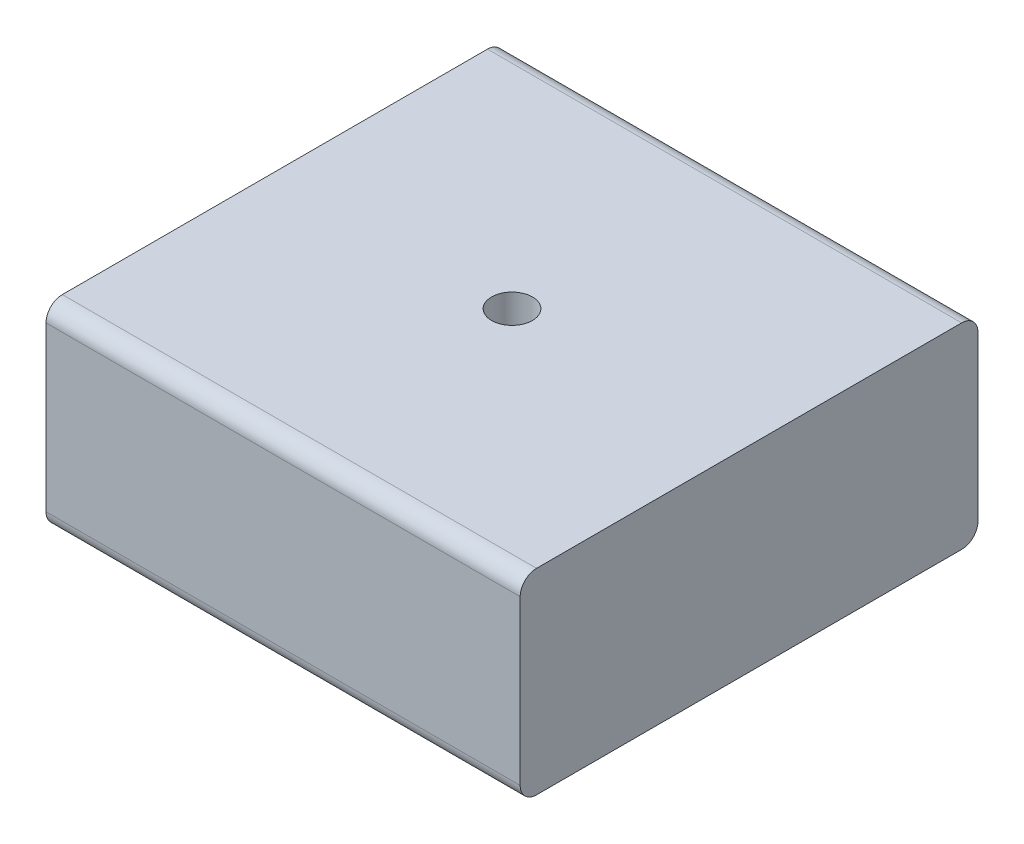
ISO-10303-21;
HEADER;
FILE_DESCRIPTION(('STEP AP214'),'2;1');
FILE_NAME('part.step','',(''),(''),'','','');
FILE_SCHEMA(('AUTOMOTIVE_DESIGN { 1 0 10303 214 1 1 1 1 }'));
ENDSEC;
DATA;
#1=APPLICATION_CONTEXT('core data for automotive mechanical design processes');
#2=APPLICATION_PROTOCOL_DEFINITION('international standard','automotive_design',2000,#1);
#3=PRODUCT_CONTEXT('',#1,'mechanical');
#4=PRODUCT('Part','Part','',(#3));
#5=PRODUCT_RELATED_PRODUCT_CATEGORY('part','',(#4));
#6=PRODUCT_DEFINITION_FORMATION('','',#4);
#7=PRODUCT_DEFINITION_CONTEXT('part definition',#1,'design');
#8=PRODUCT_DEFINITION('design','',#6,#7);
#9=PRODUCT_DEFINITION_SHAPE('','',#8);
#10=(LENGTH_UNIT() NAMED_UNIT(*) SI_UNIT(.MILLI.,.METRE.));
#11=(NAMED_UNIT(*) PLANE_ANGLE_UNIT() SI_UNIT($,.RADIAN.));
#12=(NAMED_UNIT(*) SI_UNIT($,.STERADIAN.) SOLID_ANGLE_UNIT());
#13=UNCERTAINTY_MEASURE_WITH_UNIT(LENGTH_MEASURE(1.E-05),#10,'distance_accuracy_value','');
#14=(GEOMETRIC_REPRESENTATION_CONTEXT(3) GLOBAL_UNCERTAINTY_ASSIGNED_CONTEXT((#13)) GLOBAL_UNIT_ASSIGNED_CONTEXT((#10,
#11,#12)) REPRESENTATION_CONTEXT('',''));
#15=CARTESIAN_POINT('',(0.,0.,0.));
#16=DIRECTION('',(0.,0.,1.));
#17=DIRECTION('',(1.,0.,0.));
#18=AXIS2_PLACEMENT_3D('',#15,#16,#17);
#19=CARTESIAN_POINT('',(-46.0375,38.1,88.9));
#20=DIRECTION('',(0.,-1.,0.));
#21=DIRECTION('',(1.,0.,0.));
#22=AXIS2_PLACEMENT_3D('',#19,#20,#21);
#23=PLANE('',#22);
#24=DIRECTION('',(0.,0.,-1.));
#25=VECTOR('',#24,1.);
#26=CARTESIAN_POINT('',(46.0375,38.1,88.9));
#27=LINE('',#26,#25);
#28=CARTESIAN_POINT('',(46.0375,38.1,85.725));
#29=VERTEX_POINT('',#28);
#30=CARTESIAN_POINT('',(46.0375,38.1,3.175));
#31=VERTEX_POINT('',#30);
#32=EDGE_CURVE('E121',#29,#31,#27,.T.);
#33=ORIENTED_EDGE('',*,*,#32,.T.);
#34=DIRECTION('',(-1.,0.,0.));
#35=VECTOR('',#34,1.);
#36=CARTESIAN_POINT('',(-46.0375,38.1,3.175));
#37=LINE('',#36,#35);
#38=CARTESIAN_POINT('',(-46.0375,38.1,3.175));
#39=VERTEX_POINT('',#38);
#40=EDGE_CURVE('E11',#31,#39,#37,.T.);
#41=ORIENTED_EDGE('',*,*,#40,.T.);
#42=DIRECTION('',(0.,0.,-1.));
#43=VECTOR('',#42,1.);
#44=CARTESIAN_POINT('',(-46.0375,38.1,88.9));
#45=LINE('',#44,#43);
#46=CARTESIAN_POINT('',(-46.0375,38.1,85.725));
#47=VERTEX_POINT('',#46);
#48=EDGE_CURVE('E152',#47,#39,#45,.T.);
#49=ORIENTED_EDGE('',*,*,#48,.F.);
#50=DIRECTION('',(-1.,0.,0.));
#51=VECTOR('',#50,1.);
#52=CARTESIAN_POINT('',(46.0375,38.1,85.725));
#53=LINE('',#52,#51);
#54=EDGE_CURVE('E41',#47,#29,#53,.F.);
#55=ORIENTED_EDGE('',*,*,#54,.T.);
#56=EDGE_LOOP('',(#33,#41,#49,#55));
#57=FACE_BOUND('',#56,.T.);
#58=CARTESIAN_POINT('',(0.,38.1,44.45));
#59=DIRECTION('',(0.,1.,0.));
#60=DIRECTION('',(0.,0.,1.));
#61=AXIS2_PLACEMENT_3D('',#58,#59,#60);
#62=CIRCLE('',#61,3.96874999999999);
#63=CARTESIAN_POINT('',(0.,38.1,48.41875));
#64=VERTEX_POINT('',#63);
#65=EDGE_CURVE('E224',#64,#64,#62,.T.);
#66=ORIENTED_EDGE('',*,*,#65,.F.);
#67=EDGE_LOOP('',(#66));
#68=FACE_BOUND('',#67,.T.);
#69=ADVANCED_FACE('F33',(#57,#68),#23,.F.);
#70=CARTESIAN_POINT('',(-46.0375,38.1,88.9));
#71=DIRECTION('',(1.,0.,0.));
#72=DIRECTION('',(0.,1.,0.));
#73=AXIS2_PLACEMENT_3D('',#70,#71,#72);
#74=PLANE('',#73);
#75=DIRECTION('',(0.,-1.,0.));
#76=VECTOR('',#75,1.);
#77=CARTESIAN_POINT('',(-46.0375,38.1,0.));
#78=LINE('',#77,#76);
#79=CARTESIAN_POINT('',(-46.0375,34.925,0.));
#80=VERTEX_POINT('',#79);
#81=CARTESIAN_POINT('',(-46.0375,3.17500000000001,0.));
#82=VERTEX_POINT('',#81);
#83=EDGE_CURVE('E168',#80,#82,#78,.T.);
#84=ORIENTED_EDGE('',*,*,#83,.T.);
#85=CARTESIAN_POINT('',(-46.0375,3.175,3.175));
#86=DIRECTION('',(1.,0.,0.));
#87=DIRECTION('',(0.,1.,0.));
#88=AXIS2_PLACEMENT_3D('',#85,#86,#87);
#89=CIRCLE('',#88,3.175);
#90=CARTESIAN_POINT('',(-46.0375,0.,3.175));
#91=VERTEX_POINT('',#90);
#92=EDGE_CURVE('E141',#82,#91,#89,.F.);
#93=ORIENTED_EDGE('',*,*,#92,.T.);
#94=DIRECTION('',(0.,0.,-1.));
#95=VECTOR('',#94,1.);
#96=CARTESIAN_POINT('',(-46.0375,0.,88.9));
#97=LINE('',#96,#95);
#98=CARTESIAN_POINT('',(-46.0375,0.,85.725));
#99=VERTEX_POINT('',#98);
#100=EDGE_CURVE('E120',#99,#91,#97,.T.);
#101=ORIENTED_EDGE('',*,*,#100,.F.);
#102=CARTESIAN_POINT('',(-46.0375,3.175,85.725));
#103=DIRECTION('',(1.,0.,0.));
#104=DIRECTION('',(0.,1.,0.));
#105=AXIS2_PLACEMENT_3D('',#102,#103,#104);
#106=CIRCLE('',#105,3.175);
#107=CARTESIAN_POINT('',(-46.0375,3.17500000000001,88.9));
#108=VERTEX_POINT('',#107);
#109=EDGE_CURVE('E125',#99,#108,#106,.F.);
#110=ORIENTED_EDGE('',*,*,#109,.T.);
#111=DIRECTION('',(0.,-1.,0.));
#112=VECTOR('',#111,1.);
#113=CARTESIAN_POINT('',(-46.0375,38.1,88.9));
#114=LINE('',#113,#112);
#115=CARTESIAN_POINT('',(-46.0375,34.925,88.9));
#116=VERTEX_POINT('',#115);
#117=EDGE_CURVE('E162',#116,#108,#114,.T.);
#118=ORIENTED_EDGE('',*,*,#117,.F.);
#119=CARTESIAN_POINT('',(-46.0375,34.925,85.725));
#120=DIRECTION('',(1.,0.,0.));
#121=DIRECTION('',(0.,1.,0.));
#122=AXIS2_PLACEMENT_3D('',#119,#120,#121);
#123=CIRCLE('',#122,3.175);
#124=EDGE_CURVE('E55',#116,#47,#123,.F.);
#125=ORIENTED_EDGE('',*,*,#124,.T.);
#126=ORIENTED_EDGE('',*,*,#48,.T.);
#127=CARTESIAN_POINT('',(-46.0375,34.925,3.175));
#128=DIRECTION('',(1.,0.,0.));
#129=DIRECTION('',(0.,1.,0.));
#130=AXIS2_PLACEMENT_3D('',#127,#128,#129);
#131=CIRCLE('',#130,3.175);
#132=EDGE_CURVE('E48',#39,#80,#131,.F.);
#133=ORIENTED_EDGE('',*,*,#132,.T.);
#134=EDGE_LOOP('',(#84,#93,#101,#110,#118,#125,#126,#133));
#135=FACE_BOUND('',#134,.T.);
#136=ADVANCED_FACE('F164',(#135),#74,.F.);
#137=CARTESIAN_POINT('',(-46.0375,0.,88.9));
#138=DIRECTION('',(0.,1.,0.));
#139=DIRECTION('',(-1.,0.,0.));
#140=AXIS2_PLACEMENT_3D('',#137,#138,#139);
#141=PLANE('',#140);
#142=CARTESIAN_POINT('',(0.,0.,44.45));
#143=DIRECTION('',(0.,1.,0.));
#144=DIRECTION('',(-1.,0.,0.));
#145=AXIS2_PLACEMENT_3D('',#142,#143,#144);
#146=CIRCLE('',#145,3.96874999999999);
#147=CARTESIAN_POINT('',(-3.96875,0.,44.45));
#148=VERTEX_POINT('',#147);
#149=EDGE_CURVE('E171',#148,#148,#146,.T.);
#150=ORIENTED_EDGE('',*,*,#149,.T.);
#151=EDGE_LOOP('',(#150));
#152=FACE_BOUND('',#151,.T.);
#153=ORIENTED_EDGE('',*,*,#100,.T.);
#154=DIRECTION('',(1.,0.,0.));
#155=VECTOR('',#154,1.);
#156=CARTESIAN_POINT('',(-46.0375,0.,3.175));
#157=LINE('',#156,#155);
#158=CARTESIAN_POINT('',(46.0375,0.,3.175));
#159=VERTEX_POINT('',#158);
#160=EDGE_CURVE('E119',#91,#159,#157,.T.);
#161=ORIENTED_EDGE('',*,*,#160,.T.);
#162=DIRECTION('',(0.,0.,-1.));
#163=VECTOR('',#162,1.);
#164=CARTESIAN_POINT('',(46.0375,0.,88.9));
#165=LINE('',#164,#163);
#166=CARTESIAN_POINT('',(46.0375,0.,85.725));
#167=VERTEX_POINT('',#166);
#168=EDGE_CURVE('E102',#167,#159,#165,.T.);
#169=ORIENTED_EDGE('',*,*,#168,.F.);
#170=DIRECTION('',(1.,0.,0.));
#171=VECTOR('',#170,1.);
#172=CARTESIAN_POINT('',(-46.0375,0.,85.725));
#173=LINE('',#172,#171);
#174=EDGE_CURVE('E116',#167,#99,#173,.F.);
#175=ORIENTED_EDGE('',*,*,#174,.T.);
#176=EDGE_LOOP('',(#153,#161,#169,#175));
#177=FACE_BOUND('',#176,.T.);
#178=ADVANCED_FACE('F115',(#152,#177),#141,.F.);
#179=CARTESIAN_POINT('',(46.0375,38.1,88.9));
#180=DIRECTION('',(-1.,0.,0.));
#181=DIRECTION('',(0.,-1.,0.));
#182=AXIS2_PLACEMENT_3D('',#179,#180,#181);
#183=PLANE('',#182);
#184=ORIENTED_EDGE('',*,*,#168,.T.);
#185=CARTESIAN_POINT('',(46.0375,3.17500000000002,3.175));
#186=DIRECTION('',(-1.,0.,0.));
#187=DIRECTION('',(0.,-1.,0.));
#188=AXIS2_PLACEMENT_3D('',#185,#186,#187);
#189=CIRCLE('',#188,3.175);
#190=CARTESIAN_POINT('',(46.0375,3.17500000000003,0.));
#191=VERTEX_POINT('',#190);
#192=EDGE_CURVE('E109',#159,#191,#189,.F.);
#193=ORIENTED_EDGE('',*,*,#192,.T.);
#194=DIRECTION('',(0.,1.,0.));
#195=VECTOR('',#194,1.);
#196=CARTESIAN_POINT('',(46.0375,38.1,0.));
#197=LINE('',#196,#195);
#198=CARTESIAN_POINT('',(46.0375,34.925,0.));
#199=VERTEX_POINT('',#198);
#200=EDGE_CURVE('E165',#191,#199,#197,.T.);
#201=ORIENTED_EDGE('',*,*,#200,.T.);
#202=CARTESIAN_POINT('',(46.0375,34.925,3.175));
#203=DIRECTION('',(-1.,0.,0.));
#204=DIRECTION('',(0.,-1.,0.));
#205=AXIS2_PLACEMENT_3D('',#202,#203,#204);
#206=CIRCLE('',#205,3.175);
#207=EDGE_CURVE('E110',#199,#31,#206,.F.);
#208=ORIENTED_EDGE('',*,*,#207,.T.);
#209=ORIENTED_EDGE('',*,*,#32,.F.);
#210=CARTESIAN_POINT('',(46.0375,34.925,85.725));
#211=DIRECTION('',(-1.,0.,0.));
#212=DIRECTION('',(0.,-1.,0.));
#213=AXIS2_PLACEMENT_3D('',#210,#211,#212);
#214=CIRCLE('',#213,3.175);
#215=CARTESIAN_POINT('',(46.0375,34.925,88.9));
#216=VERTEX_POINT('',#215);
#217=EDGE_CURVE('E127',#29,#216,#214,.F.);
#218=ORIENTED_EDGE('',*,*,#217,.T.);
#219=DIRECTION('',(0.,1.,0.));
#220=VECTOR('',#219,1.);
#221=CARTESIAN_POINT('',(46.0375,38.1,88.9));
#222=LINE('',#221,#220);
#223=CARTESIAN_POINT('',(46.0375,3.17500000000003,88.9));
#224=VERTEX_POINT('',#223);
#225=EDGE_CURVE('E104',#224,#216,#222,.T.);
#226=ORIENTED_EDGE('',*,*,#225,.F.);
#227=CARTESIAN_POINT('',(46.0375,3.17500000000002,85.725));
#228=DIRECTION('',(-1.,0.,0.));
#229=DIRECTION('',(0.,-1.,0.));
#230=AXIS2_PLACEMENT_3D('',#227,#228,#229);
#231=CIRCLE('',#230,3.175);
#232=EDGE_CURVE('E99',#224,#167,#231,.F.);
#233=ORIENTED_EDGE('',*,*,#232,.T.);
#234=EDGE_LOOP('',(#184,#193,#201,#208,#209,#218,#226,#233));
#235=FACE_BOUND('',#234,.T.);
#236=ADVANCED_FACE('F101',(#235),#183,.F.);
#237=CARTESIAN_POINT('',(0.,0.,88.9));
#238=DIRECTION('',(0.,0.,1.));
#239=DIRECTION('',(1.,0.,0.));
#240=AXIS2_PLACEMENT_3D('',#237,#238,#239);
#241=PLANE('',#240);
#242=ORIENTED_EDGE('',*,*,#117,.T.);
#243=DIRECTION('',(1.,0.,0.));
#244=VECTOR('',#243,1.);
#245=CARTESIAN_POINT('',(46.0375,3.17500000000002,88.9));
#246=LINE('',#245,#244);
#247=EDGE_CURVE('E146',#108,#224,#246,.T.);
#248=ORIENTED_EDGE('',*,*,#247,.T.);
#249=ORIENTED_EDGE('',*,*,#225,.T.);
#250=DIRECTION('',(-1.,0.,0.));
#251=VECTOR('',#250,1.);
#252=CARTESIAN_POINT('',(-46.0375,34.925,88.9));
#253=LINE('',#252,#251);
#254=EDGE_CURVE('E143',#216,#116,#253,.T.);
#255=ORIENTED_EDGE('',*,*,#254,.T.);
#256=EDGE_LOOP('',(#242,#248,#249,#255));
#257=FACE_BOUND('',#256,.T.);
#258=ADVANCED_FACE('F161',(#257),#241,.T.);
#259=CARTESIAN_POINT('',(0.,0.,0.));
#260=DIRECTION('',(0.,0.,1.));
#261=DIRECTION('',(1.,0.,0.));
#262=AXIS2_PLACEMENT_3D('',#259,#260,#261);
#263=PLANE('',#262);
#264=ORIENTED_EDGE('',*,*,#200,.F.);
#265=DIRECTION('',(1.,0.,0.));
#266=VECTOR('',#265,1.);
#267=CARTESIAN_POINT('',(0.,3.17500000000001,0.));
#268=LINE('',#267,#266);
#269=EDGE_CURVE('E136',#191,#82,#268,.F.);
#270=ORIENTED_EDGE('',*,*,#269,.T.);
#271=ORIENTED_EDGE('',*,*,#83,.F.);
#272=DIRECTION('',(-1.,0.,0.));
#273=VECTOR('',#272,1.);
#274=CARTESIAN_POINT('',(0.,34.925,0.));
#275=LINE('',#274,#273);
#276=EDGE_CURVE('E134',#80,#199,#275,.F.);
#277=ORIENTED_EDGE('',*,*,#276,.T.);
#278=EDGE_LOOP('',(#264,#270,#271,#277));
#279=FACE_BOUND('',#278,.T.);
#280=ADVANCED_FACE('F179',(#279),#263,.F.);
#281=CARTESIAN_POINT('',(-46.0375,3.175,3.175));
#282=DIRECTION('',(1.,0.,0.));
#283=DIRECTION('',(0.,1.,0.));
#284=AXIS2_PLACEMENT_3D('',#281,#282,#283);
#285=CYLINDRICAL_SURFACE('',#284,3.175);
#286=ORIENTED_EDGE('',*,*,#92,.F.);
#287=ORIENTED_EDGE('',*,*,#269,.F.);
#288=ORIENTED_EDGE('',*,*,#192,.F.);
#289=ORIENTED_EDGE('',*,*,#160,.F.);
#290=EDGE_LOOP('',(#286,#287,#288,#289));
#291=FACE_BOUND('',#290,.T.);
#292=ADVANCED_FACE('F188',(#291),#285,.T.);
#293=CARTESIAN_POINT('',(0.,3.17500000000001,85.725));
#294=DIRECTION('',(-1.,0.,0.));
#295=DIRECTION('',(0.,-1.,0.));
#296=AXIS2_PLACEMENT_3D('',#293,#294,#295);
#297=CYLINDRICAL_SURFACE('',#296,3.175);
#298=ORIENTED_EDGE('',*,*,#109,.F.);
#299=ORIENTED_EDGE('',*,*,#174,.F.);
#300=ORIENTED_EDGE('',*,*,#232,.F.);
#301=ORIENTED_EDGE('',*,*,#247,.F.);
#302=EDGE_LOOP('',(#298,#299,#300,#301));
#303=FACE_BOUND('',#302,.T.);
#304=ADVANCED_FACE('F124',(#303),#297,.T.);
#305=CARTESIAN_POINT('',(-46.0375,34.925,3.175));
#306=DIRECTION('',(-1.,0.,0.));
#307=DIRECTION('',(0.,-1.,0.));
#308=AXIS2_PLACEMENT_3D('',#305,#306,#307);
#309=CYLINDRICAL_SURFACE('',#308,3.175);
#310=ORIENTED_EDGE('',*,*,#207,.F.);
#311=ORIENTED_EDGE('',*,*,#276,.F.);
#312=ORIENTED_EDGE('',*,*,#132,.F.);
#313=ORIENTED_EDGE('',*,*,#40,.F.);
#314=EDGE_LOOP('',(#310,#311,#312,#313));
#315=FACE_BOUND('',#314,.T.);
#316=ADVANCED_FACE('F181',(#315),#309,.T.);
#317=CARTESIAN_POINT('',(0.,34.925,85.725));
#318=DIRECTION('',(1.,0.,0.));
#319=DIRECTION('',(0.,1.,0.));
#320=AXIS2_PLACEMENT_3D('',#317,#318,#319);
#321=CYLINDRICAL_SURFACE('',#320,3.175);
#322=ORIENTED_EDGE('',*,*,#217,.F.);
#323=ORIENTED_EDGE('',*,*,#54,.F.);
#324=ORIENTED_EDGE('',*,*,#124,.F.);
#325=ORIENTED_EDGE('',*,*,#254,.F.);
#326=EDGE_LOOP('',(#322,#323,#324,#325));
#327=FACE_BOUND('',#326,.T.);
#328=ADVANCED_FACE('F35',(#327),#321,.T.);
#329=CARTESIAN_POINT('',(0.,38.1,44.45));
#330=DIRECTION('',(0.,1.,0.));
#331=DIRECTION('',(0.,0.,1.));
#332=AXIS2_PLACEMENT_3D('',#329,#330,#331);
#333=CYLINDRICAL_SURFACE('',#332,3.96874999999999);
#334=ORIENTED_EDGE('',*,*,#149,.F.);
#335=EDGE_LOOP('',(#334));
#336=FACE_BOUND('',#335,.T.);
#337=ORIENTED_EDGE('',*,*,#65,.T.);
#338=EDGE_LOOP('',(#337));
#339=FACE_BOUND('',#338,.T.);
#340=ADVANCED_FACE('F187',(#336,#339),#333,.F.);
#341=CLOSED_SHELL('',(#69,#136,#178,#236,#258,#280,#292,#304,#316,#328,#340));
#342=MANIFOLD_SOLID_BREP('B2',#341);
#343=ADVANCED_BREP_SHAPE_REPRESENTATION('',(#18,#342),#14);
#344=SHAPE_DEFINITION_REPRESENTATION(#9,#343);
ENDSEC;
END-ISO-10303-21;
